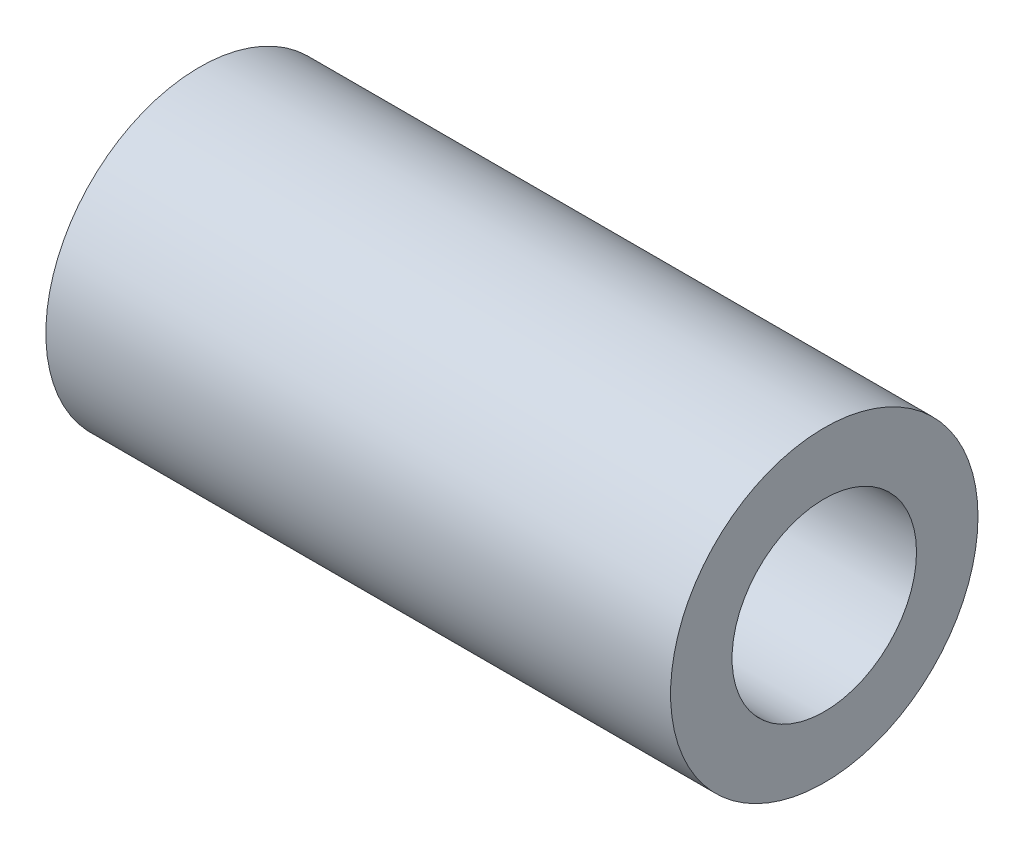
ISO-10303-21;
HEADER;
FILE_DESCRIPTION(('STEP AP214'),'2;1');
FILE_NAME('part.step','',(''),(''),'','','');
FILE_SCHEMA(('AUTOMOTIVE_DESIGN { 1 0 10303 214 1 1 1 1 }'));
ENDSEC;
DATA;
#1=APPLICATION_CONTEXT('core data for automotive mechanical design processes');
#2=APPLICATION_PROTOCOL_DEFINITION('international standard','automotive_design',2000,#1);
#3=PRODUCT_CONTEXT('',#1,'mechanical');
#4=PRODUCT('Part','Part','',(#3));
#5=PRODUCT_RELATED_PRODUCT_CATEGORY('part','',(#4));
#6=PRODUCT_DEFINITION_FORMATION('','',#4);
#7=PRODUCT_DEFINITION_CONTEXT('part definition',#1,'design');
#8=PRODUCT_DEFINITION('design','',#6,#7);
#9=PRODUCT_DEFINITION_SHAPE('','',#8);
#10=(LENGTH_UNIT() NAMED_UNIT(*) SI_UNIT(.MILLI.,.METRE.));
#11=(NAMED_UNIT(*) PLANE_ANGLE_UNIT() SI_UNIT($,.RADIAN.));
#12=(NAMED_UNIT(*) SI_UNIT($,.STERADIAN.) SOLID_ANGLE_UNIT());
#13=UNCERTAINTY_MEASURE_WITH_UNIT(LENGTH_MEASURE(1.E-05),#10,'distance_accuracy_value','');
#14=(GEOMETRIC_REPRESENTATION_CONTEXT(3) GLOBAL_UNCERTAINTY_ASSIGNED_CONTEXT((#13)) GLOBAL_UNIT_ASSIGNED_CONTEXT((#10,
#11,#12)) REPRESENTATION_CONTEXT('',''));
#15=CARTESIAN_POINT('',(0.,0.,0.));
#16=DIRECTION('',(0.,0.,1.));
#17=DIRECTION('',(1.,0.,0.));
#18=AXIS2_PLACEMENT_3D('',#15,#16,#17);
#19=CARTESIAN_POINT('',(16.129,0.,0.));
#20=DIRECTION('',(1.,0.,0.));
#21=DIRECTION('',(0.,0.,-1.));
#22=AXIS2_PLACEMENT_3D('',#19,#20,#21);
#23=PLANE('',#22);
#24=CARTESIAN_POINT('',(16.129,0.,0.));
#25=DIRECTION('',(1.,0.,0.));
#26=DIRECTION('',(0.,0.,-1.));
#27=AXIS2_PLACEMENT_3D('',#24,#25,#26);
#28=CIRCLE('',#27,7.9375);
#29=CARTESIAN_POINT('',(16.129,0.,-7.9375));
#30=VERTEX_POINT('',#29);
#31=EDGE_CURVE('E10',#30,#30,#28,.T.);
#32=ORIENTED_EDGE('',*,*,#31,.T.);
#33=EDGE_LOOP('',(#32));
#34=FACE_BOUND('',#33,.T.);
#35=CARTESIAN_POINT('',(16.129,0.,0.));
#36=DIRECTION('',(1.,0.,0.));
#37=DIRECTION('',(0.,0.,-1.));
#38=AXIS2_PLACEMENT_3D('',#35,#36,#37);
#39=CIRCLE('',#38,4.7625);
#40=CARTESIAN_POINT('',(16.129,0.,-4.7625));
#41=VERTEX_POINT('',#40);
#42=EDGE_CURVE('E42',#41,#41,#39,.T.);
#43=ORIENTED_EDGE('',*,*,#42,.F.);
#44=EDGE_LOOP('',(#43));
#45=FACE_BOUND('',#44,.T.);
#46=ADVANCED_FACE('F31',(#34,#45),#23,.T.);
#47=CARTESIAN_POINT('',(-16.129,0.,0.));
#48=DIRECTION('',(1.,0.,0.));
#49=DIRECTION('',(0.,0.,-1.));
#50=AXIS2_PLACEMENT_3D('',#47,#48,#49);
#51=PLANE('',#50);
#52=CARTESIAN_POINT('',(-16.129,0.,0.));
#53=DIRECTION('',(1.,0.,0.));
#54=DIRECTION('',(0.,0.,-1.));
#55=AXIS2_PLACEMENT_3D('',#52,#53,#54);
#56=CIRCLE('',#55,7.9375);
#57=CARTESIAN_POINT('',(-16.129,0.,-7.9375));
#58=VERTEX_POINT('',#57);
#59=EDGE_CURVE('E35',#58,#58,#56,.T.);
#60=ORIENTED_EDGE('',*,*,#59,.F.);
#61=EDGE_LOOP('',(#60));
#62=FACE_BOUND('',#61,.T.);
#63=CARTESIAN_POINT('',(-16.129,0.,0.));
#64=DIRECTION('',(1.,0.,0.));
#65=DIRECTION('',(0.,0.,-1.));
#66=AXIS2_PLACEMENT_3D('',#63,#64,#65);
#67=CIRCLE('',#66,4.7625);
#68=CARTESIAN_POINT('',(-16.129,0.,-4.7625));
#69=VERTEX_POINT('',#68);
#70=EDGE_CURVE('E44',#69,#69,#67,.T.);
#71=ORIENTED_EDGE('',*,*,#70,.T.);
#72=EDGE_LOOP('',(#71));
#73=FACE_BOUND('',#72,.T.);
#74=ADVANCED_FACE('F54',(#62,#73),#51,.F.);
#75=CARTESIAN_POINT('',(16.129,0.,0.));
#76=DIRECTION('',(-1.,0.,0.));
#77=DIRECTION('',(0.,0.,1.));
#78=AXIS2_PLACEMENT_3D('',#75,#76,#77);
#79=CYLINDRICAL_SURFACE('',#78,7.9375);
#80=ORIENTED_EDGE('',*,*,#31,.F.);
#81=EDGE_LOOP('',(#80));
#82=FACE_BOUND('',#81,.T.);
#83=ORIENTED_EDGE('',*,*,#59,.T.);
#84=EDGE_LOOP('',(#83));
#85=FACE_BOUND('',#84,.T.);
#86=ADVANCED_FACE('F33',(#82,#85),#79,.T.);
#87=CARTESIAN_POINT('',(16.129,0.,0.));
#88=DIRECTION('',(-1.,0.,0.));
#89=DIRECTION('',(0.,0.,1.));
#90=AXIS2_PLACEMENT_3D('',#87,#88,#89);
#91=CYLINDRICAL_SURFACE('',#90,4.7625);
#92=ORIENTED_EDGE('',*,*,#42,.T.);
#93=EDGE_LOOP('',(#92));
#94=FACE_BOUND('',#93,.T.);
#95=ORIENTED_EDGE('',*,*,#70,.F.);
#96=EDGE_LOOP('',(#95));
#97=FACE_BOUND('',#96,.T.);
#98=ADVANCED_FACE('F50',(#94,#97),#91,.F.);
#99=CLOSED_SHELL('',(#46,#74,#86,#98));
#100=MANIFOLD_SOLID_BREP('B2',#99);
#101=ADVANCED_BREP_SHAPE_REPRESENTATION('',(#18,#100),#14);
#102=SHAPE_DEFINITION_REPRESENTATION(#9,#101);
ENDSEC;
END-ISO-10303-21;
